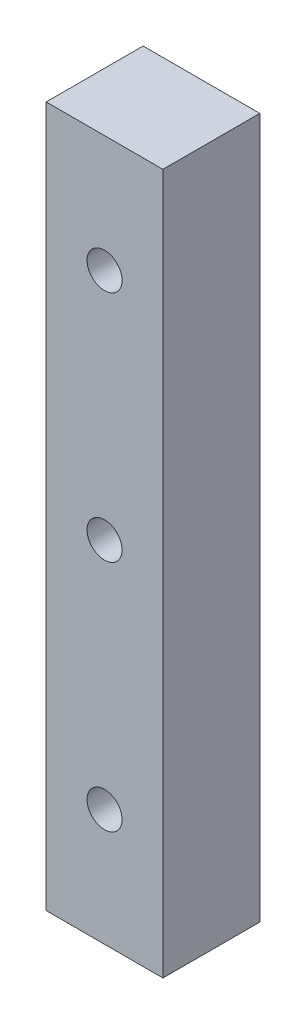
ISO-10303-21;
HEADER;
FILE_DESCRIPTION(('STEP AP214'),'2;1');
FILE_NAME('part.step','',(''),(''),'','','');
FILE_SCHEMA(('AUTOMOTIVE_DESIGN { 1 0 10303 214 1 1 1 1 }'));
ENDSEC;
DATA;
#1=APPLICATION_CONTEXT('core data for automotive mechanical design processes');
#2=APPLICATION_PROTOCOL_DEFINITION('international standard','automotive_design',2000,#1);
#3=PRODUCT_CONTEXT('',#1,'mechanical');
#4=PRODUCT('Part','Part','',(#3));
#5=PRODUCT_RELATED_PRODUCT_CATEGORY('part','',(#4));
#6=PRODUCT_DEFINITION_FORMATION('','',#4);
#7=PRODUCT_DEFINITION_CONTEXT('part definition',#1,'design');
#8=PRODUCT_DEFINITION('design','',#6,#7);
#9=PRODUCT_DEFINITION_SHAPE('','',#8);
#10=(LENGTH_UNIT() NAMED_UNIT(*) SI_UNIT(.MILLI.,.METRE.));
#11=(NAMED_UNIT(*) PLANE_ANGLE_UNIT() SI_UNIT($,.RADIAN.));
#12=(NAMED_UNIT(*) SI_UNIT($,.STERADIAN.) SOLID_ANGLE_UNIT());
#13=UNCERTAINTY_MEASURE_WITH_UNIT(LENGTH_MEASURE(1.E-05),#10,'distance_accuracy_value','');
#14=(GEOMETRIC_REPRESENTATION_CONTEXT(3) GLOBAL_UNCERTAINTY_ASSIGNED_CONTEXT((#13)) GLOBAL_UNIT_ASSIGNED_CONTEXT((#10,
#11,#12)) REPRESENTATION_CONTEXT('',''));
#15=CARTESIAN_POINT('',(0.,0.,0.));
#16=DIRECTION('',(0.,0.,1.));
#17=DIRECTION('',(1.,0.,0.));
#18=AXIS2_PLACEMENT_3D('',#15,#16,#17);
#19=CARTESIAN_POINT('',(5.,-30.,8.3));
#20=DIRECTION('',(-1.,0.,0.));
#21=DIRECTION('',(0.,0.,1.));
#22=AXIS2_PLACEMENT_3D('',#19,#20,#21);
#23=PLANE('',#22);
#24=DIRECTION('',(0.,1.,0.));
#25=VECTOR('',#24,1.);
#26=CARTESIAN_POINT('',(5.,-30.,0.));
#27=LINE('',#26,#25);
#28=CARTESIAN_POINT('',(5.,-30.,0.));
#29=VERTEX_POINT('',#28);
#30=CARTESIAN_POINT('',(5.,30.,0.));
#31=VERTEX_POINT('',#30);
#32=EDGE_CURVE('E97',#29,#31,#27,.T.);
#33=ORIENTED_EDGE('',*,*,#32,.T.);
#34=DIRECTION('',(0.,0.,-1.));
#35=VECTOR('',#34,1.);
#36=CARTESIAN_POINT('',(5.,30.,8.3));
#37=LINE('',#36,#35);
#38=CARTESIAN_POINT('',(5.,30.,8.3));
#39=VERTEX_POINT('',#38);
#40=EDGE_CURVE('E11',#39,#31,#37,.T.);
#41=ORIENTED_EDGE('',*,*,#40,.F.);
#42=DIRECTION('',(0.,1.,0.));
#43=VECTOR('',#42,1.);
#44=CARTESIAN_POINT('',(5.,-30.,8.3));
#45=LINE('',#44,#43);
#46=CARTESIAN_POINT('',(5.,-30.,8.3));
#47=VERTEX_POINT('',#46);
#48=EDGE_CURVE('E84',#47,#39,#45,.T.);
#49=ORIENTED_EDGE('',*,*,#48,.F.);
#50=DIRECTION('',(0.,0.,-1.));
#51=VECTOR('',#50,1.);
#52=CARTESIAN_POINT('',(5.,-30.,8.3));
#53=LINE('',#52,#51);
#54=EDGE_CURVE('E93',#47,#29,#53,.T.);
#55=ORIENTED_EDGE('',*,*,#54,.T.);
#56=EDGE_LOOP('',(#33,#41,#49,#55));
#57=FACE_BOUND('',#56,.T.);
#58=ADVANCED_FACE('F31',(#57),#23,.F.);
#59=CARTESIAN_POINT('',(-5.,30.,8.3));
#60=DIRECTION('',(0.,-1.,0.));
#61=DIRECTION('',(0.,0.,-1.));
#62=AXIS2_PLACEMENT_3D('',#59,#60,#61);
#63=PLANE('',#62);
#64=DIRECTION('',(-1.,0.,0.));
#65=VECTOR('',#64,1.);
#66=CARTESIAN_POINT('',(-5.,30.,0.));
#67=LINE('',#66,#65);
#68=CARTESIAN_POINT('',(-5.,30.,0.));
#69=VERTEX_POINT('',#68);
#70=EDGE_CURVE('E88',#31,#69,#67,.T.);
#71=ORIENTED_EDGE('',*,*,#70,.T.);
#72=DIRECTION('',(0.,0.,-1.));
#73=VECTOR('',#72,1.);
#74=CARTESIAN_POINT('',(-5.,30.,8.3));
#75=LINE('',#74,#73);
#76=CARTESIAN_POINT('',(-5.,30.,8.3));
#77=VERTEX_POINT('',#76);
#78=EDGE_CURVE('E40',#77,#69,#75,.T.);
#79=ORIENTED_EDGE('',*,*,#78,.F.);
#80=DIRECTION('',(-1.,0.,0.));
#81=VECTOR('',#80,1.);
#82=CARTESIAN_POINT('',(-5.,30.,8.3));
#83=LINE('',#82,#81);
#84=EDGE_CURVE('E79',#39,#77,#83,.T.);
#85=ORIENTED_EDGE('',*,*,#84,.F.);
#86=ORIENTED_EDGE('',*,*,#40,.T.);
#87=EDGE_LOOP('',(#71,#79,#85,#86));
#88=FACE_BOUND('',#87,.T.);
#89=ADVANCED_FACE('F87',(#88),#63,.F.);
#90=CARTESIAN_POINT('',(-5.,-30.,8.3));
#91=DIRECTION('',(1.,0.,0.));
#92=DIRECTION('',(0.,0.,-1.));
#93=AXIS2_PLACEMENT_3D('',#90,#91,#92);
#94=PLANE('',#93);
#95=DIRECTION('',(0.,-1.,0.));
#96=VECTOR('',#95,1.);
#97=CARTESIAN_POINT('',(-5.,-30.,0.));
#98=LINE('',#97,#96);
#99=CARTESIAN_POINT('',(-5.,-30.,0.));
#100=VERTEX_POINT('',#99);
#101=EDGE_CURVE('E66',#69,#100,#98,.T.);
#102=ORIENTED_EDGE('',*,*,#101,.T.);
#103=DIRECTION('',(0.,0.,-1.));
#104=VECTOR('',#103,1.);
#105=CARTESIAN_POINT('',(-5.,-30.,8.3));
#106=LINE('',#105,#104);
#107=CARTESIAN_POINT('',(-5.,-30.,8.3));
#108=VERTEX_POINT('',#107);
#109=EDGE_CURVE('E89',#108,#100,#106,.T.);
#110=ORIENTED_EDGE('',*,*,#109,.F.);
#111=DIRECTION('',(0.,-1.,0.));
#112=VECTOR('',#111,1.);
#113=CARTESIAN_POINT('',(-5.,-30.,8.3));
#114=LINE('',#113,#112);
#115=EDGE_CURVE('E82',#77,#108,#114,.T.);
#116=ORIENTED_EDGE('',*,*,#115,.F.);
#117=ORIENTED_EDGE('',*,*,#78,.T.);
#118=EDGE_LOOP('',(#102,#110,#116,#117));
#119=FACE_BOUND('',#118,.T.);
#120=ADVANCED_FACE('F91',(#119),#94,.F.);
#121=CARTESIAN_POINT('',(-5.,-30.,8.3));
#122=DIRECTION('',(0.,1.,0.));
#123=DIRECTION('',(0.,0.,1.));
#124=AXIS2_PLACEMENT_3D('',#121,#122,#123);
#125=PLANE('',#124);
#126=DIRECTION('',(1.,0.,0.));
#127=VECTOR('',#126,1.);
#128=CARTESIAN_POINT('',(-5.,-30.,0.));
#129=LINE('',#128,#127);
#130=EDGE_CURVE('E72',#100,#29,#129,.T.);
#131=ORIENTED_EDGE('',*,*,#130,.T.);
#132=ORIENTED_EDGE('',*,*,#54,.F.);
#133=DIRECTION('',(1.,0.,0.));
#134=VECTOR('',#133,1.);
#135=CARTESIAN_POINT('',(-5.,-30.,8.3));
#136=LINE('',#135,#134);
#137=EDGE_CURVE('E49',#108,#47,#136,.T.);
#138=ORIENTED_EDGE('',*,*,#137,.F.);
#139=ORIENTED_EDGE('',*,*,#109,.T.);
#140=EDGE_LOOP('',(#131,#132,#138,#139));
#141=FACE_BOUND('',#140,.T.);
#142=ADVANCED_FACE('F130',(#141),#125,.F.);
#143=CARTESIAN_POINT('',(5.,30.,8.3));
#144=DIRECTION('',(0.,0.,-1.));
#145=DIRECTION('',(-1.,0.,0.));
#146=AXIS2_PLACEMENT_3D('',#143,#144,#145);
#147=PLANE('',#146);
#148=CARTESIAN_POINT('',(0.,20.0000000000001,8.3));
#149=DIRECTION('',(0.,0.,1.));
#150=DIRECTION('',(1.,0.,0.));
#151=AXIS2_PLACEMENT_3D('',#148,#149,#150);
#152=CIRCLE('',#151,1.5);
#153=CARTESIAN_POINT('',(1.49999999999998,20.0000000000001,8.3));
#154=VERTEX_POINT('',#153);
#155=EDGE_CURVE('E120',#154,#154,#152,.T.);
#156=ORIENTED_EDGE('',*,*,#155,.F.);
#157=EDGE_LOOP('',(#156));
#158=FACE_BOUND('',#157,.T.);
#159=CARTESIAN_POINT('',(0.,0.,8.3));
#160=DIRECTION('',(0.,0.,1.));
#161=DIRECTION('',(1.,0.,0.));
#162=AXIS2_PLACEMENT_3D('',#159,#160,#161);
#163=CIRCLE('',#162,1.5);
#164=CARTESIAN_POINT('',(1.49999999999998,0.,8.3));
#165=VERTEX_POINT('',#164);
#166=EDGE_CURVE('E110',#165,#165,#163,.T.);
#167=ORIENTED_EDGE('',*,*,#166,.F.);
#168=EDGE_LOOP('',(#167));
#169=FACE_BOUND('',#168,.T.);
#170=CARTESIAN_POINT('',(0.,-19.9999999999999,8.3));
#171=DIRECTION('',(0.,0.,1.));
#172=DIRECTION('',(1.,0.,0.));
#173=AXIS2_PLACEMENT_3D('',#170,#171,#172);
#174=CIRCLE('',#173,1.5);
#175=CARTESIAN_POINT('',(1.49999999999999,-19.9999999999999,8.3));
#176=VERTEX_POINT('',#175);
#177=EDGE_CURVE('E107',#176,#176,#174,.T.);
#178=ORIENTED_EDGE('',*,*,#177,.F.);
#179=EDGE_LOOP('',(#178));
#180=FACE_BOUND('',#179,.T.);
#181=ORIENTED_EDGE('',*,*,#48,.T.);
#182=ORIENTED_EDGE('',*,*,#84,.T.);
#183=ORIENTED_EDGE('',*,*,#115,.T.);
#184=ORIENTED_EDGE('',*,*,#137,.T.);
#185=EDGE_LOOP('',(#181,#182,#183,#184));
#186=FACE_BOUND('',#185,.T.);
#187=ADVANCED_FACE('F80',(#158,#169,#180,#186),#147,.F.);
#188=CARTESIAN_POINT('',(5.,30.,0.));
#189=DIRECTION('',(0.,0.,-1.));
#190=DIRECTION('',(-1.,0.,0.));
#191=AXIS2_PLACEMENT_3D('',#188,#189,#190);
#192=PLANE('',#191);
#193=CARTESIAN_POINT('',(0.,20.0000000000001,0.));
#194=DIRECTION('',(0.,0.,-1.));
#195=DIRECTION('',(-1.,0.,0.));
#196=AXIS2_PLACEMENT_3D('',#193,#194,#195);
#197=CIRCLE('',#196,1.5);
#198=CARTESIAN_POINT('',(-1.50000000000002,20.0000000000001,0.));
#199=VERTEX_POINT('',#198);
#200=EDGE_CURVE('E34',#199,#199,#197,.T.);
#201=ORIENTED_EDGE('',*,*,#200,.F.);
#202=EDGE_LOOP('',(#201));
#203=FACE_BOUND('',#202,.T.);
#204=CARTESIAN_POINT('',(0.,0.,0.));
#205=DIRECTION('',(0.,0.,-1.));
#206=DIRECTION('',(-1.,0.,0.));
#207=AXIS2_PLACEMENT_3D('',#204,#205,#206);
#208=CIRCLE('',#207,1.5);
#209=CARTESIAN_POINT('',(-1.50000000000002,0.,0.));
#210=VERTEX_POINT('',#209);
#211=EDGE_CURVE('E108',#210,#210,#208,.T.);
#212=ORIENTED_EDGE('',*,*,#211,.F.);
#213=EDGE_LOOP('',(#212));
#214=FACE_BOUND('',#213,.T.);
#215=CARTESIAN_POINT('',(0.,-19.9999999999999,0.));
#216=DIRECTION('',(0.,0.,-1.));
#217=DIRECTION('',(-1.,0.,0.));
#218=AXIS2_PLACEMENT_3D('',#215,#216,#217);
#219=CIRCLE('',#218,1.5);
#220=CARTESIAN_POINT('',(-1.50000000000002,-19.9999999999999,0.));
#221=VERTEX_POINT('',#220);
#222=EDGE_CURVE('E100',#221,#221,#219,.T.);
#223=ORIENTED_EDGE('',*,*,#222,.F.);
#224=EDGE_LOOP('',(#223));
#225=FACE_BOUND('',#224,.T.);
#226=ORIENTED_EDGE('',*,*,#32,.F.);
#227=ORIENTED_EDGE('',*,*,#130,.F.);
#228=ORIENTED_EDGE('',*,*,#101,.F.);
#229=ORIENTED_EDGE('',*,*,#70,.F.);
#230=EDGE_LOOP('',(#226,#227,#228,#229));
#231=FACE_BOUND('',#230,.T.);
#232=ADVANCED_FACE('F129',(#203,#214,#225,#231),#192,.T.);
#233=CARTESIAN_POINT('',(0.,-19.9999999999999,-1.7));
#234=DIRECTION('',(0.,0.,1.));
#235=DIRECTION('',(1.,0.,0.));
#236=AXIS2_PLACEMENT_3D('',#233,#234,#235);
#237=CYLINDRICAL_SURFACE('',#236,1.5);
#238=ORIENTED_EDGE('',*,*,#222,.T.);
#239=EDGE_LOOP('',(#238));
#240=FACE_BOUND('',#239,.T.);
#241=ORIENTED_EDGE('',*,*,#177,.T.);
#242=EDGE_LOOP('',(#241));
#243=FACE_BOUND('',#242,.T.);
#244=ADVANCED_FACE('F135',(#240,#243),#237,.F.);
#245=CARTESIAN_POINT('',(0.,0.,-1.7));
#246=DIRECTION('',(0.,0.,1.));
#247=DIRECTION('',(1.,0.,0.));
#248=AXIS2_PLACEMENT_3D('',#245,#246,#247);
#249=CYLINDRICAL_SURFACE('',#248,1.5);
#250=ORIENTED_EDGE('',*,*,#211,.T.);
#251=EDGE_LOOP('',(#250));
#252=FACE_BOUND('',#251,.T.);
#253=ORIENTED_EDGE('',*,*,#166,.T.);
#254=EDGE_LOOP('',(#253));
#255=FACE_BOUND('',#254,.T.);
#256=ADVANCED_FACE('F137',(#252,#255),#249,.F.);
#257=CARTESIAN_POINT('',(0.,20.0000000000001,-1.7));
#258=DIRECTION('',(0.,0.,1.));
#259=DIRECTION('',(1.,0.,0.));
#260=AXIS2_PLACEMENT_3D('',#257,#258,#259);
#261=CYLINDRICAL_SURFACE('',#260,1.5);
#262=ORIENTED_EDGE('',*,*,#200,.T.);
#263=EDGE_LOOP('',(#262));
#264=FACE_BOUND('',#263,.T.);
#265=ORIENTED_EDGE('',*,*,#155,.T.);
#266=EDGE_LOOP('',(#265));
#267=FACE_BOUND('',#266,.T.);
#268=ADVANCED_FACE('F125',(#264,#267),#261,.F.);
#269=CLOSED_SHELL('',(#58,#89,#120,#142,#187,#232,#244,#256,#268));
#270=MANIFOLD_SOLID_BREP('B2',#269);
#271=ADVANCED_BREP_SHAPE_REPRESENTATION('',(#18,#270),#14);
#272=SHAPE_DEFINITION_REPRESENTATION(#9,#271);
ENDSEC;
END-ISO-10303-21;
